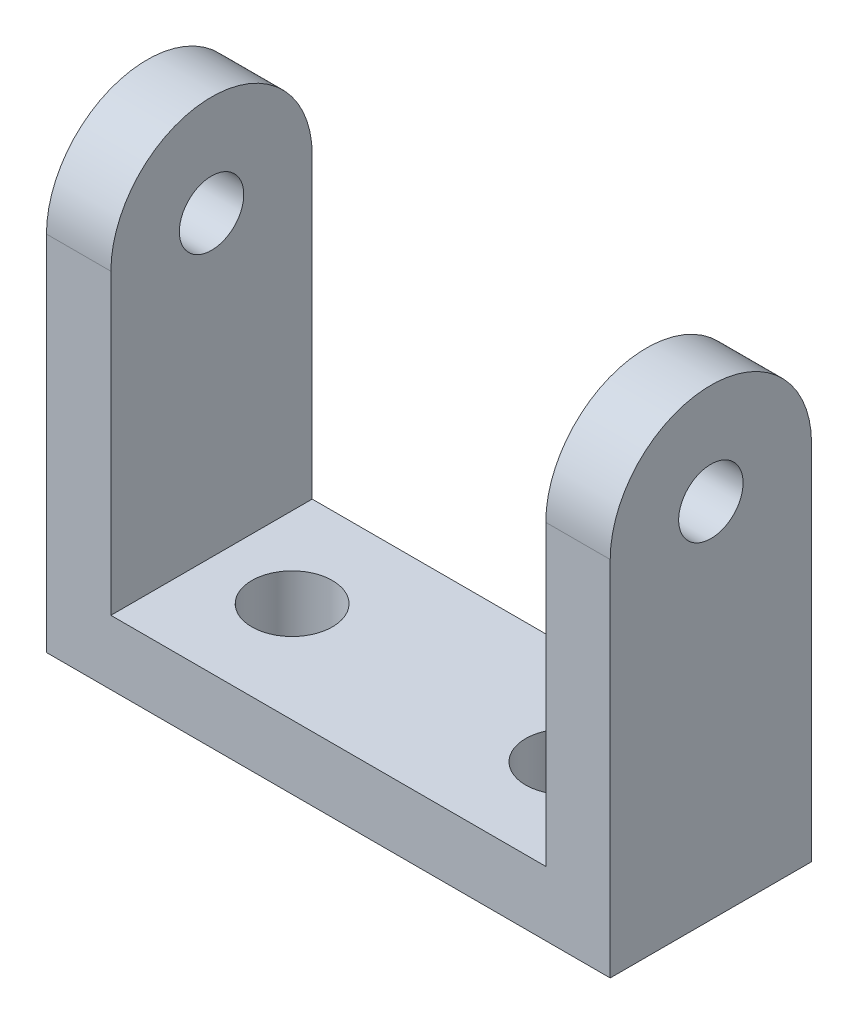
ISO-10303-21;
HEADER;
FILE_DESCRIPTION(('STEP AP214'),'2;1');
FILE_NAME('part.step','',(''),(''),'','','');
FILE_SCHEMA(('AUTOMOTIVE_DESIGN { 1 0 10303 214 1 1 1 1 }'));
ENDSEC;
DATA;
#1=APPLICATION_CONTEXT('core data for automotive mechanical design processes');
#2=APPLICATION_PROTOCOL_DEFINITION('international standard','automotive_design',2000,#1);
#3=PRODUCT_CONTEXT('',#1,'mechanical');
#4=PRODUCT('Part','Part','',(#3));
#5=PRODUCT_RELATED_PRODUCT_CATEGORY('part','',(#4));
#6=PRODUCT_DEFINITION_FORMATION('','',#4);
#7=PRODUCT_DEFINITION_CONTEXT('part definition',#1,'design');
#8=PRODUCT_DEFINITION('design','',#6,#7);
#9=PRODUCT_DEFINITION_SHAPE('','',#8);
#10=(LENGTH_UNIT() NAMED_UNIT(*) SI_UNIT(.MILLI.,.METRE.));
#11=(NAMED_UNIT(*) PLANE_ANGLE_UNIT() SI_UNIT($,.RADIAN.));
#12=(NAMED_UNIT(*) SI_UNIT($,.STERADIAN.) SOLID_ANGLE_UNIT());
#13=UNCERTAINTY_MEASURE_WITH_UNIT(LENGTH_MEASURE(1.E-05),#10,'distance_accuracy_value','');
#14=(GEOMETRIC_REPRESENTATION_CONTEXT(3) GLOBAL_UNCERTAINTY_ASSIGNED_CONTEXT((#13)) GLOBAL_UNIT_ASSIGNED_CONTEXT((#10,
#11,#12)) REPRESENTATION_CONTEXT('',''));
#15=CARTESIAN_POINT('',(0.,0.,0.));
#16=DIRECTION('',(0.,0.,1.));
#17=DIRECTION('',(1.,0.,0.));
#18=AXIS2_PLACEMENT_3D('',#15,#16,#17);
#19=CARTESIAN_POINT('',(0.,7.99999999999999,25.));
#20=DIRECTION('',(0.,-1.,0.));
#21=DIRECTION('',(0.,0.,-1.));
#22=AXIS2_PLACEMENT_3D('',#19,#20,#21);
#23=PLANE('',#22);
#24=DIRECTION('',(-1.,0.,0.));
#25=VECTOR('',#24,1.);
#26=CARTESIAN_POINT('',(0.,7.99999999999999,0.));
#27=LINE('',#26,#25);
#28=CARTESIAN_POINT('',(27.,8.,0.));
#29=VERTEX_POINT('',#28);
#30=CARTESIAN_POINT('',(-27.,7.99999999999999,0.));
#31=VERTEX_POINT('',#30);
#32=EDGE_CURVE('E188',#29,#31,#27,.T.);
#33=ORIENTED_EDGE('',*,*,#32,.T.);
#34=DIRECTION('',(0.,0.,-1.));
#35=VECTOR('',#34,1.);
#36=CARTESIAN_POINT('',(-27.,7.99999999999999,25.));
#37=LINE('',#36,#35);
#38=CARTESIAN_POINT('',(-27.,7.99999999999999,25.));
#39=VERTEX_POINT('',#38);
#40=EDGE_CURVE('E50',#39,#31,#37,.T.);
#41=ORIENTED_EDGE('',*,*,#40,.F.);
#42=DIRECTION('',(-1.,0.,0.));
#43=VECTOR('',#42,1.);
#44=CARTESIAN_POINT('',(0.,7.99999999999999,25.));
#45=LINE('',#44,#43);
#46=CARTESIAN_POINT('',(27.,8.,25.));
#47=VERTEX_POINT('',#46);
#48=EDGE_CURVE('E169',#47,#39,#45,.T.);
#49=ORIENTED_EDGE('',*,*,#48,.F.);
#50=DIRECTION('',(0.,0.,-1.));
#51=VECTOR('',#50,1.);
#52=CARTESIAN_POINT('',(27.,8.,25.));
#53=LINE('',#52,#51);
#54=EDGE_CURVE('E11',#47,#29,#53,.T.);
#55=ORIENTED_EDGE('',*,*,#54,.T.);
#56=EDGE_LOOP('',(#33,#41,#49,#55));
#57=FACE_BOUND('',#56,.T.);
#58=CARTESIAN_POINT('',(17.,7.99999999999999,12.5));
#59=DIRECTION('',(0.,1.,0.));
#60=DIRECTION('',(0.,0.,1.));
#61=AXIS2_PLACEMENT_3D('',#58,#59,#60);
#62=CIRCLE('',#61,5.);
#63=CARTESIAN_POINT('',(17.,7.99999999999999,17.5));
#64=VERTEX_POINT('',#63);
#65=EDGE_CURVE('E231',#64,#64,#62,.F.);
#66=ORIENTED_EDGE('',*,*,#65,.T.);
#67=EDGE_LOOP('',(#66));
#68=FACE_BOUND('',#67,.T.);
#69=CARTESIAN_POINT('',(-17.,7.99999999999999,12.5));
#70=DIRECTION('',(0.,1.,0.));
#71=DIRECTION('',(0.,0.,1.));
#72=AXIS2_PLACEMENT_3D('',#69,#70,#71);
#73=CIRCLE('',#72,5.);
#74=CARTESIAN_POINT('',(-17.,7.99999999999999,17.5));
#75=VERTEX_POINT('',#74);
#76=EDGE_CURVE('E234',#75,#75,#73,.T.);
#77=ORIENTED_EDGE('',*,*,#76,.F.);
#78=EDGE_LOOP('',(#77));
#79=FACE_BOUND('',#78,.T.);
#80=ADVANCED_FACE('F40',(#57,#68,#79),#23,.F.);
#81=CARTESIAN_POINT('',(0.,0.,25.));
#82=DIRECTION('',(0.,1.,0.));
#83=DIRECTION('',(0.,0.,1.));
#84=AXIS2_PLACEMENT_3D('',#81,#82,#83);
#85=PLANE('',#84);
#86=DIRECTION('',(1.,0.,0.));
#87=VECTOR('',#86,1.);
#88=CARTESIAN_POINT('',(0.,0.,0.));
#89=LINE('',#88,#87);
#90=CARTESIAN_POINT('',(-35.,0.,0.));
#91=VERTEX_POINT('',#90);
#92=CARTESIAN_POINT('',(35.,0.,0.));
#93=VERTEX_POINT('',#92);
#94=EDGE_CURVE('E82',#91,#93,#89,.T.);
#95=ORIENTED_EDGE('',*,*,#94,.T.);
#96=DIRECTION('',(0.,0.,-1.));
#97=VECTOR('',#96,1.);
#98=CARTESIAN_POINT('',(35.,0.,25.));
#99=LINE('',#98,#97);
#100=CARTESIAN_POINT('',(35.,0.,25.));
#101=VERTEX_POINT('',#100);
#102=EDGE_CURVE('E176',#101,#93,#99,.T.);
#103=ORIENTED_EDGE('',*,*,#102,.F.);
#104=DIRECTION('',(1.,0.,0.));
#105=VECTOR('',#104,1.);
#106=CARTESIAN_POINT('',(0.,0.,25.));
#107=LINE('',#106,#105);
#108=CARTESIAN_POINT('',(-35.,0.,25.));
#109=VERTEX_POINT('',#108);
#110=EDGE_CURVE('E58',#109,#101,#107,.T.);
#111=ORIENTED_EDGE('',*,*,#110,.F.);
#112=DIRECTION('',(0.,0.,-1.));
#113=VECTOR('',#112,1.);
#114=CARTESIAN_POINT('',(-35.,0.,25.));
#115=LINE('',#114,#113);
#116=EDGE_CURVE('E126',#109,#91,#115,.T.);
#117=ORIENTED_EDGE('',*,*,#116,.T.);
#118=EDGE_LOOP('',(#95,#103,#111,#117));
#119=FACE_BOUND('',#118,.T.);
#120=CARTESIAN_POINT('',(17.,0.,12.5));
#121=DIRECTION('',(0.,1.,0.));
#122=DIRECTION('',(0.,0.,1.));
#123=AXIS2_PLACEMENT_3D('',#120,#121,#122);
#124=CIRCLE('',#123,5.);
#125=CARTESIAN_POINT('',(17.,0.,17.5));
#126=VERTEX_POINT('',#125);
#127=EDGE_CURVE('E238',#126,#126,#124,.F.);
#128=ORIENTED_EDGE('',*,*,#127,.F.);
#129=EDGE_LOOP('',(#128));
#130=FACE_BOUND('',#129,.T.);
#131=CARTESIAN_POINT('',(-17.,0.,12.5));
#132=DIRECTION('',(0.,1.,0.));
#133=DIRECTION('',(0.,0.,1.));
#134=AXIS2_PLACEMENT_3D('',#131,#132,#133);
#135=CIRCLE('',#134,5.);
#136=CARTESIAN_POINT('',(-17.,0.,17.5));
#137=VERTEX_POINT('',#136);
#138=EDGE_CURVE('E237',#137,#137,#135,.T.);
#139=ORIENTED_EDGE('',*,*,#138,.T.);
#140=EDGE_LOOP('',(#139));
#141=FACE_BOUND('',#140,.T.);
#142=ADVANCED_FACE('F214',(#119,#130,#141),#85,.F.);
#143=CARTESIAN_POINT('',(35.,0.,25.));
#144=DIRECTION('',(-1.,0.,0.));
#145=DIRECTION('',(0.,0.,1.));
#146=AXIS2_PLACEMENT_3D('',#143,#144,#145);
#147=PLANE('',#146);
#148=CARTESIAN_POINT('',(35.,45.,12.5));
#149=DIRECTION('',(1.,0.,0.));
#150=DIRECTION('',(0.,0.,-1.));
#151=AXIS2_PLACEMENT_3D('',#148,#149,#150);
#152=CIRCLE('',#151,4.);
#153=CARTESIAN_POINT('',(35.,45.,8.5));
#154=VERTEX_POINT('',#153);
#155=EDGE_CURVE('E139',#154,#154,#152,.T.);
#156=ORIENTED_EDGE('',*,*,#155,.F.);
#157=EDGE_LOOP('',(#156));
#158=FACE_BOUND('',#157,.T.);
#159=DIRECTION('',(0.,1.,0.));
#160=VECTOR('',#159,1.);
#161=CARTESIAN_POINT('',(35.,0.,0.));
#162=LINE('',#161,#160);
#163=CARTESIAN_POINT('',(35.,45.,0.));
#164=VERTEX_POINT('',#163);
#165=EDGE_CURVE('E157',#93,#164,#162,.T.);
#166=ORIENTED_EDGE('',*,*,#165,.T.);
#167=CARTESIAN_POINT('',(35.,45.,12.5));
#168=DIRECTION('',(1.,0.,0.));
#169=DIRECTION('',(0.,0.,-1.));
#170=AXIS2_PLACEMENT_3D('',#167,#168,#169);
#171=CIRCLE('',#170,12.5);
#172=CARTESIAN_POINT('',(35.,45.,25.));
#173=VERTEX_POINT('',#172);
#174=EDGE_CURVE('E152',#173,#164,#171,.F.);
#175=ORIENTED_EDGE('',*,*,#174,.F.);
#176=DIRECTION('',(0.,1.,0.));
#177=VECTOR('',#176,1.);
#178=CARTESIAN_POINT('',(35.,0.,25.));
#179=LINE('',#178,#177);
#180=EDGE_CURVE('E92',#101,#173,#179,.T.);
#181=ORIENTED_EDGE('',*,*,#180,.F.);
#182=ORIENTED_EDGE('',*,*,#102,.T.);
#183=EDGE_LOOP('',(#166,#175,#181,#182));
#184=FACE_BOUND('',#183,.T.);
#185=ADVANCED_FACE('F42',(#158,#184),#147,.F.);
#186=CARTESIAN_POINT('',(27.,8.,25.));
#187=DIRECTION('',(1.,0.,0.));
#188=DIRECTION('',(0.,0.,-1.));
#189=AXIS2_PLACEMENT_3D('',#186,#187,#188);
#190=PLANE('',#189);
#191=CARTESIAN_POINT('',(27.,45.,12.5));
#192=DIRECTION('',(1.,0.,0.));
#193=DIRECTION('',(0.,0.,-1.));
#194=AXIS2_PLACEMENT_3D('',#191,#192,#193);
#195=CIRCLE('',#194,4.);
#196=CARTESIAN_POINT('',(27.,45.,8.5));
#197=VERTEX_POINT('',#196);
#198=EDGE_CURVE('E148',#197,#197,#195,.F.);
#199=ORIENTED_EDGE('',*,*,#198,.F.);
#200=EDGE_LOOP('',(#199));
#201=FACE_BOUND('',#200,.T.);
#202=DIRECTION('',(0.,-1.,0.));
#203=VECTOR('',#202,1.);
#204=CARTESIAN_POINT('',(27.,8.,0.));
#205=LINE('',#204,#203);
#206=CARTESIAN_POINT('',(27.,45.,0.));
#207=VERTEX_POINT('',#206);
#208=EDGE_CURVE('E184',#207,#29,#205,.T.);
#209=ORIENTED_EDGE('',*,*,#208,.T.);
#210=ORIENTED_EDGE('',*,*,#54,.F.);
#211=DIRECTION('',(0.,-1.,0.));
#212=VECTOR('',#211,1.);
#213=CARTESIAN_POINT('',(27.,8.,25.));
#214=LINE('',#213,#212);
#215=CARTESIAN_POINT('',(27.,45.,25.));
#216=VERTEX_POINT('',#215);
#217=EDGE_CURVE('E166',#216,#47,#214,.T.);
#218=ORIENTED_EDGE('',*,*,#217,.F.);
#219=CARTESIAN_POINT('',(27.,45.,12.5));
#220=DIRECTION('',(1.,0.,0.));
#221=DIRECTION('',(0.,0.,-1.));
#222=AXIS2_PLACEMENT_3D('',#219,#220,#221);
#223=CIRCLE('',#222,12.5);
#224=EDGE_CURVE('E153',#207,#216,#223,.T.);
#225=ORIENTED_EDGE('',*,*,#224,.F.);
#226=EDGE_LOOP('',(#209,#210,#218,#225));
#227=FACE_BOUND('',#226,.T.);
#228=ADVANCED_FACE('F224',(#201,#227),#190,.F.);
#229=CARTESIAN_POINT('',(-27.,7.99999999999999,25.));
#230=DIRECTION('',(-1.,0.,0.));
#231=DIRECTION('',(0.,0.,1.));
#232=AXIS2_PLACEMENT_3D('',#229,#230,#231);
#233=PLANE('',#232);
#234=CARTESIAN_POINT('',(-27.,45.,12.5));
#235=DIRECTION('',(-1.,0.,0.));
#236=DIRECTION('',(0.,0.,1.));
#237=AXIS2_PLACEMENT_3D('',#234,#235,#236);
#238=CIRCLE('',#237,4.);
#239=CARTESIAN_POINT('',(-27.,45.,16.5));
#240=VERTEX_POINT('',#239);
#241=EDGE_CURVE('E135',#240,#240,#238,.F.);
#242=ORIENTED_EDGE('',*,*,#241,.F.);
#243=EDGE_LOOP('',(#242));
#244=FACE_BOUND('',#243,.T.);
#245=DIRECTION('',(0.,1.,0.));
#246=VECTOR('',#245,1.);
#247=CARTESIAN_POINT('',(-27.,7.99999999999999,0.));
#248=LINE('',#247,#246);
#249=CARTESIAN_POINT('',(-27.,45.,0.));
#250=VERTEX_POINT('',#249);
#251=EDGE_CURVE('E191',#31,#250,#248,.T.);
#252=ORIENTED_EDGE('',*,*,#251,.T.);
#253=CARTESIAN_POINT('',(-27.,45.,12.5));
#254=DIRECTION('',(-1.,0.,0.));
#255=DIRECTION('',(0.,0.,1.));
#256=AXIS2_PLACEMENT_3D('',#253,#254,#255);
#257=CIRCLE('',#256,12.5);
#258=CARTESIAN_POINT('',(-27.,45.,25.));
#259=VERTEX_POINT('',#258);
#260=EDGE_CURVE('E134',#259,#250,#257,.T.);
#261=ORIENTED_EDGE('',*,*,#260,.F.);
#262=DIRECTION('',(0.,1.,0.));
#263=VECTOR('',#262,1.);
#264=CARTESIAN_POINT('',(-27.,7.99999999999999,25.));
#265=LINE('',#264,#263);
#266=EDGE_CURVE('E114',#39,#259,#265,.T.);
#267=ORIENTED_EDGE('',*,*,#266,.F.);
#268=ORIENTED_EDGE('',*,*,#40,.T.);
#269=EDGE_LOOP('',(#252,#261,#267,#268));
#270=FACE_BOUND('',#269,.T.);
#271=ADVANCED_FACE('F209',(#244,#270),#233,.F.);
#272=CARTESIAN_POINT('',(-35.,0.,25.));
#273=DIRECTION('',(1.,0.,0.));
#274=DIRECTION('',(0.,0.,-1.));
#275=AXIS2_PLACEMENT_3D('',#272,#273,#274);
#276=PLANE('',#275);
#277=CARTESIAN_POINT('',(-35.,45.,12.5));
#278=DIRECTION('',(-1.,0.,0.));
#279=DIRECTION('',(0.,0.,1.));
#280=AXIS2_PLACEMENT_3D('',#277,#278,#279);
#281=CIRCLE('',#280,4.);
#282=CARTESIAN_POINT('',(-35.,45.,16.5));
#283=VERTEX_POINT('',#282);
#284=EDGE_CURVE('E142',#283,#283,#281,.T.);
#285=ORIENTED_EDGE('',*,*,#284,.F.);
#286=EDGE_LOOP('',(#285));
#287=FACE_BOUND('',#286,.T.);
#288=DIRECTION('',(0.,-1.,0.));
#289=VECTOR('',#288,1.);
#290=CARTESIAN_POINT('',(-35.,0.,0.));
#291=LINE('',#290,#289);
#292=CARTESIAN_POINT('',(-35.,45.,0.));
#293=VERTEX_POINT('',#292);
#294=EDGE_CURVE('E196',#293,#91,#291,.T.);
#295=ORIENTED_EDGE('',*,*,#294,.T.);
#296=ORIENTED_EDGE('',*,*,#116,.F.);
#297=DIRECTION('',(0.,-1.,0.));
#298=VECTOR('',#297,1.);
#299=CARTESIAN_POINT('',(-35.,0.,25.));
#300=LINE('',#299,#298);
#301=CARTESIAN_POINT('',(-35.,45.,25.));
#302=VERTEX_POINT('',#301);
#303=EDGE_CURVE('E111',#302,#109,#300,.T.);
#304=ORIENTED_EDGE('',*,*,#303,.F.);
#305=CARTESIAN_POINT('',(-35.,45.,12.5));
#306=DIRECTION('',(-1.,0.,0.));
#307=DIRECTION('',(0.,0.,1.));
#308=AXIS2_PLACEMENT_3D('',#305,#306,#307);
#309=CIRCLE('',#308,12.5);
#310=EDGE_CURVE('E125',#293,#302,#309,.F.);
#311=ORIENTED_EDGE('',*,*,#310,.F.);
#312=EDGE_LOOP('',(#295,#296,#304,#311));
#313=FACE_BOUND('',#312,.T.);
#314=ADVANCED_FACE('F123',(#287,#313),#276,.F.);
#315=CARTESIAN_POINT('',(0.,0.,25.));
#316=DIRECTION('',(0.,0.,1.));
#317=DIRECTION('',(1.,0.,0.));
#318=AXIS2_PLACEMENT_3D('',#315,#316,#317);
#319=PLANE('',#318);
#320=ORIENTED_EDGE('',*,*,#180,.T.);
#321=DIRECTION('',(-1.,0.,0.));
#322=VECTOR('',#321,1.);
#323=CARTESIAN_POINT('',(35.,45.,25.));
#324=LINE('',#323,#322);
#325=EDGE_CURVE('E163',#173,#216,#324,.T.);
#326=ORIENTED_EDGE('',*,*,#325,.T.);
#327=ORIENTED_EDGE('',*,*,#217,.T.);
#328=ORIENTED_EDGE('',*,*,#48,.T.);
#329=ORIENTED_EDGE('',*,*,#266,.T.);
#330=DIRECTION('',(-1.,0.,0.));
#331=VECTOR('',#330,1.);
#332=CARTESIAN_POINT('',(-35.,45.,25.));
#333=LINE('',#332,#331);
#334=EDGE_CURVE('E108',#259,#302,#333,.T.);
#335=ORIENTED_EDGE('',*,*,#334,.T.);
#336=ORIENTED_EDGE('',*,*,#303,.T.);
#337=ORIENTED_EDGE('',*,*,#110,.T.);
#338=EDGE_LOOP('',(#320,#326,#327,#328,#329,#335,#336,#337));
#339=FACE_BOUND('',#338,.T.);
#340=ADVANCED_FACE('F110',(#339),#319,.T.);
#341=CARTESIAN_POINT('',(0.,0.,0.));
#342=DIRECTION('',(0.,0.,1.));
#343=DIRECTION('',(1.,0.,0.));
#344=AXIS2_PLACEMENT_3D('',#341,#342,#343);
#345=PLANE('',#344);
#346=ORIENTED_EDGE('',*,*,#165,.F.);
#347=ORIENTED_EDGE('',*,*,#94,.F.);
#348=ORIENTED_EDGE('',*,*,#294,.F.);
#349=DIRECTION('',(-1.,0.,0.));
#350=VECTOR('',#349,1.);
#351=CARTESIAN_POINT('',(-35.,45.,0.));
#352=LINE('',#351,#350);
#353=EDGE_CURVE('E132',#250,#293,#352,.T.);
#354=ORIENTED_EDGE('',*,*,#353,.F.);
#355=ORIENTED_EDGE('',*,*,#251,.F.);
#356=ORIENTED_EDGE('',*,*,#32,.F.);
#357=ORIENTED_EDGE('',*,*,#208,.F.);
#358=DIRECTION('',(-1.,0.,0.));
#359=VECTOR('',#358,1.);
#360=CARTESIAN_POINT('',(35.,45.,0.));
#361=LINE('',#360,#359);
#362=EDGE_CURVE('E180',#164,#207,#361,.T.);
#363=ORIENTED_EDGE('',*,*,#362,.F.);
#364=EDGE_LOOP('',(#346,#347,#348,#354,#355,#356,#357,#363));
#365=FACE_BOUND('',#364,.T.);
#366=ADVANCED_FACE('F212',(#365),#345,.F.);
#367=CARTESIAN_POINT('',(-0.950849718747378,45.,12.5));
#368=DIRECTION('',(1.,0.,0.));
#369=DIRECTION('',(0.,0.,-1.));
#370=AXIS2_PLACEMENT_3D('',#367,#368,#369);
#371=CYLINDRICAL_SURFACE('',#370,12.5);
#372=ORIENTED_EDGE('',*,*,#362,.T.);
#373=ORIENTED_EDGE('',*,*,#224,.T.);
#374=ORIENTED_EDGE('',*,*,#325,.F.);
#375=ORIENTED_EDGE('',*,*,#174,.T.);
#376=EDGE_LOOP('',(#372,#373,#374,#375));
#377=FACE_BOUND('',#376,.T.);
#378=ADVANCED_FACE('F219',(#377),#371,.T.);
#379=CARTESIAN_POINT('',(15.6862915010153,45.,12.5));
#380=DIRECTION('',(1.,0.,0.));
#381=DIRECTION('',(0.,0.,-1.));
#382=AXIS2_PLACEMENT_3D('',#379,#380,#381);
#383=CYLINDRICAL_SURFACE('',#382,4.);
#384=ORIENTED_EDGE('',*,*,#198,.T.);
#385=EDGE_LOOP('',(#384));
#386=FACE_BOUND('',#385,.T.);
#387=ORIENTED_EDGE('',*,*,#155,.T.);
#388=EDGE_LOOP('',(#387));
#389=FACE_BOUND('',#388,.T.);
#390=ADVANCED_FACE('F274',(#386,#389),#383,.F.);
#391=CARTESIAN_POINT('',(0.950849718747378,45.,12.5));
#392=DIRECTION('',(-1.,0.,0.));
#393=DIRECTION('',(0.,0.,1.));
#394=AXIS2_PLACEMENT_3D('',#391,#392,#393);
#395=CYLINDRICAL_SURFACE('',#394,12.5);
#396=ORIENTED_EDGE('',*,*,#334,.F.);
#397=ORIENTED_EDGE('',*,*,#260,.T.);
#398=ORIENTED_EDGE('',*,*,#353,.T.);
#399=ORIENTED_EDGE('',*,*,#310,.T.);
#400=EDGE_LOOP('',(#396,#397,#398,#399));
#401=FACE_BOUND('',#400,.T.);
#402=ADVANCED_FACE('F130',(#401),#395,.T.);
#403=CARTESIAN_POINT('',(-15.6862915010152,45.,12.5));
#404=DIRECTION('',(-1.,0.,0.));
#405=DIRECTION('',(0.,0.,1.));
#406=AXIS2_PLACEMENT_3D('',#403,#404,#405);
#407=CYLINDRICAL_SURFACE('',#406,4.);
#408=ORIENTED_EDGE('',*,*,#241,.T.);
#409=EDGE_LOOP('',(#408));
#410=FACE_BOUND('',#409,.T.);
#411=ORIENTED_EDGE('',*,*,#284,.T.);
#412=EDGE_LOOP('',(#411));
#413=FACE_BOUND('',#412,.T.);
#414=ADVANCED_FACE('F253',(#410,#413),#407,.F.);
#415=CARTESIAN_POINT('',(17.,0.,12.5));
#416=DIRECTION('',(0.,1.,0.));
#417=DIRECTION('',(0.,0.,1.));
#418=AXIS2_PLACEMENT_3D('',#415,#416,#417);
#419=CYLINDRICAL_SURFACE('',#418,5.);
#420=ORIENTED_EDGE('',*,*,#127,.T.);
#421=EDGE_LOOP('',(#420));
#422=FACE_BOUND('',#421,.T.);
#423=ORIENTED_EDGE('',*,*,#65,.F.);
#424=EDGE_LOOP('',(#423));
#425=FACE_BOUND('',#424,.T.);
#426=ADVANCED_FACE('F350',(#422,#425),#419,.F.);
#427=CARTESIAN_POINT('',(-17.,0.,12.5));
#428=DIRECTION('',(0.,1.,0.));
#429=DIRECTION('',(0.,0.,1.));
#430=AXIS2_PLACEMENT_3D('',#427,#428,#429);
#431=CYLINDRICAL_SURFACE('',#430,5.);
#432=ORIENTED_EDGE('',*,*,#138,.F.);
#433=EDGE_LOOP('',(#432));
#434=FACE_BOUND('',#433,.T.);
#435=ORIENTED_EDGE('',*,*,#76,.T.);
#436=EDGE_LOOP('',(#435));
#437=FACE_BOUND('',#436,.T.);
#438=ADVANCED_FACE('F373',(#434,#437),#431,.F.);
#439=CLOSED_SHELL('',(#80,#142,#185,#228,#271,#314,#340,#366,#378,#390,#402,#414,#426,#438));
#440=MANIFOLD_SOLID_BREP('B2',#439);
#441=ADVANCED_BREP_SHAPE_REPRESENTATION('',(#18,#440),#14);
#442=SHAPE_DEFINITION_REPRESENTATION(#9,#441);
ENDSEC;
END-ISO-10303-21;
